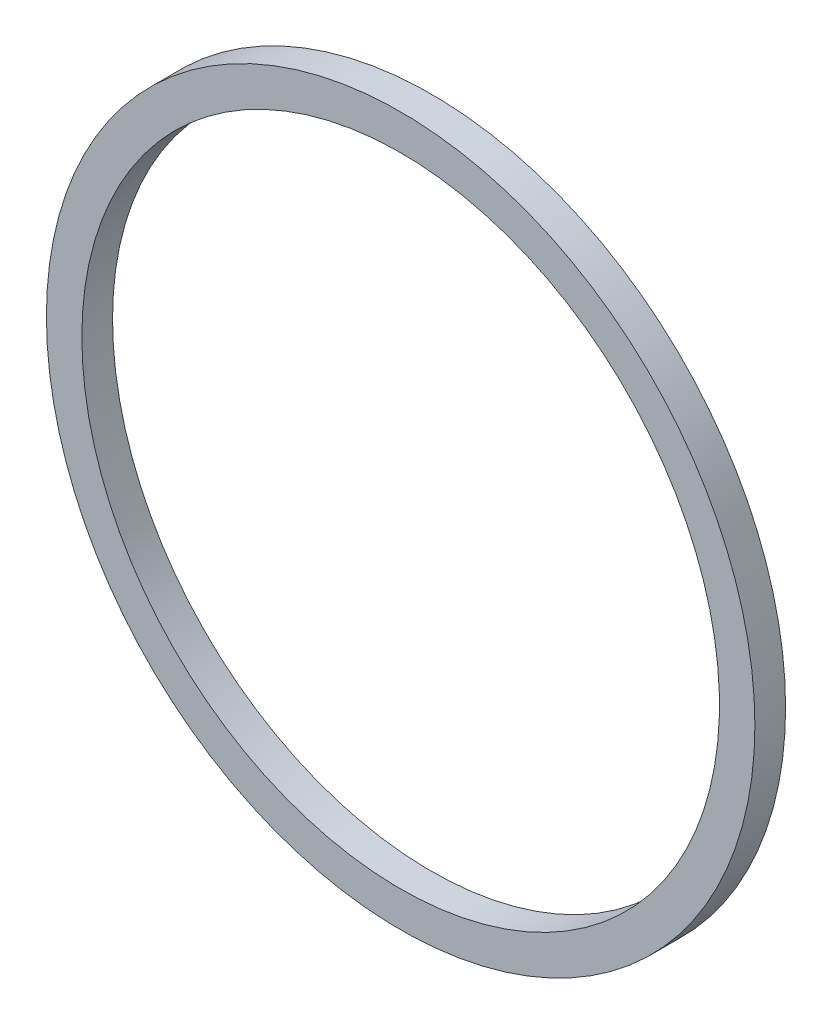
ISO-10303-21;
HEADER;
FILE_DESCRIPTION(('STEP AP214'),'2;1');
FILE_NAME('part.step','',(''),(''),'','','');
FILE_SCHEMA(('AUTOMOTIVE_DESIGN { 1 0 10303 214 1 1 1 1 }'));
ENDSEC;
DATA;
#1=APPLICATION_CONTEXT('core data for automotive mechanical design processes');
#2=APPLICATION_PROTOCOL_DEFINITION('international standard','automotive_design',2000,#1);
#3=PRODUCT_CONTEXT('',#1,'mechanical');
#4=PRODUCT('Part','Part','',(#3));
#5=PRODUCT_RELATED_PRODUCT_CATEGORY('part','',(#4));
#6=PRODUCT_DEFINITION_FORMATION('','',#4);
#7=PRODUCT_DEFINITION_CONTEXT('part definition',#1,'design');
#8=PRODUCT_DEFINITION('design','',#6,#7);
#9=PRODUCT_DEFINITION_SHAPE('','',#8);
#10=(LENGTH_UNIT() NAMED_UNIT(*) SI_UNIT(.MILLI.,.METRE.));
#11=(NAMED_UNIT(*) PLANE_ANGLE_UNIT() SI_UNIT($,.RADIAN.));
#12=(NAMED_UNIT(*) SI_UNIT($,.STERADIAN.) SOLID_ANGLE_UNIT());
#13=UNCERTAINTY_MEASURE_WITH_UNIT(LENGTH_MEASURE(1.E-05),#10,'distance_accuracy_value','');
#14=(GEOMETRIC_REPRESENTATION_CONTEXT(3) GLOBAL_UNCERTAINTY_ASSIGNED_CONTEXT((#13)) GLOBAL_UNIT_ASSIGNED_CONTEXT((#10,
#11,#12)) REPRESENTATION_CONTEXT('',''));
#15=CARTESIAN_POINT('',(0.,0.,0.));
#16=DIRECTION('',(0.,0.,1.));
#17=DIRECTION('',(1.,0.,0.));
#18=AXIS2_PLACEMENT_3D('',#15,#16,#17);
#19=CARTESIAN_POINT('',(0.,0.,13.));
#20=DIRECTION('',(0.,0.,1.));
#21=DIRECTION('',(1.,0.,0.));
#22=AXIS2_PLACEMENT_3D('',#19,#20,#21);
#23=PLANE('',#22);
#24=CARTESIAN_POINT('',(0.,0.,13.));
#25=DIRECTION('',(0.,0.,1.));
#26=DIRECTION('',(1.,0.,0.));
#27=AXIS2_PLACEMENT_3D('',#24,#25,#26);
#28=CIRCLE('',#27,150.);
#29=CARTESIAN_POINT('',(-150.,0.,13.));
#30=VERTEX_POINT('',#29);
#31=EDGE_CURVE('E10',#30,#30,#28,.T.);
#32=ORIENTED_EDGE('',*,*,#31,.T.);
#33=EDGE_LOOP('',(#32));
#34=FACE_BOUND('',#33,.T.);
#35=CARTESIAN_POINT('',(0.,0.,13.));
#36=DIRECTION('',(0.,0.,1.));
#37=DIRECTION('',(1.,0.,0.));
#38=AXIS2_PLACEMENT_3D('',#35,#36,#37);
#39=CIRCLE('',#38,135.);
#40=CARTESIAN_POINT('',(-135.,0.,13.));
#41=VERTEX_POINT('',#40);
#42=EDGE_CURVE('E46',#41,#41,#39,.T.);
#43=ORIENTED_EDGE('',*,*,#42,.F.);
#44=EDGE_LOOP('',(#43));
#45=FACE_BOUND('',#44,.T.);
#46=ADVANCED_FACE('F35',(#34,#45),#23,.T.);
#47=CARTESIAN_POINT('',(0.,0.,0.));
#48=DIRECTION('',(0.,0.,1.));
#49=DIRECTION('',(1.,0.,0.));
#50=AXIS2_PLACEMENT_3D('',#47,#48,#49);
#51=PLANE('',#50);
#52=CARTESIAN_POINT('',(0.,0.,0.));
#53=DIRECTION('',(0.,0.,1.));
#54=DIRECTION('',(1.,0.,0.));
#55=AXIS2_PLACEMENT_3D('',#52,#53,#54);
#56=CIRCLE('',#55,150.);
#57=CARTESIAN_POINT('',(-150.,0.,0.));
#58=VERTEX_POINT('',#57);
#59=EDGE_CURVE('E39',#58,#58,#56,.T.);
#60=ORIENTED_EDGE('',*,*,#59,.F.);
#61=EDGE_LOOP('',(#60));
#62=FACE_BOUND('',#61,.T.);
#63=CARTESIAN_POINT('',(0.,0.,0.));
#64=DIRECTION('',(0.,0.,1.));
#65=DIRECTION('',(1.,0.,0.));
#66=AXIS2_PLACEMENT_3D('',#63,#64,#65);
#67=CIRCLE('',#66,135.);
#68=CARTESIAN_POINT('',(-135.,0.,0.));
#69=VERTEX_POINT('',#68);
#70=EDGE_CURVE('E48',#69,#69,#67,.T.);
#71=ORIENTED_EDGE('',*,*,#70,.T.);
#72=EDGE_LOOP('',(#71));
#73=FACE_BOUND('',#72,.T.);
#74=ADVANCED_FACE('F58',(#62,#73),#51,.F.);
#75=CARTESIAN_POINT('',(0.,0.,13.));
#76=DIRECTION('',(0.,0.,-1.));
#77=DIRECTION('',(-1.,0.,0.));
#78=AXIS2_PLACEMENT_3D('',#75,#76,#77);
#79=CYLINDRICAL_SURFACE('',#78,150.);
#80=CARTESIAN_POINT('',(-150.,0.,13.));
#81=CARTESIAN_POINT('',(-150.,0.,12.8645833333333));
#82=CARTESIAN_POINT('',(-150.,0.,12.7291666666667));
#83=CARTESIAN_POINT('',(-150.,0.,12.4583333333333));
#84=CARTESIAN_POINT('',(-150.,0.,12.3229166666667));
#85=CARTESIAN_POINT('',(-150.,0.,12.0520833333333));
#86=CARTESIAN_POINT('',(-150.,0.,11.9166666666667));
#87=CARTESIAN_POINT('',(-150.,0.,11.6458333333333));
#88=CARTESIAN_POINT('',(-150.,0.,11.5104166666667));
#89=CARTESIAN_POINT('',(-150.,0.,11.2395833333333));
#90=CARTESIAN_POINT('',(-150.,0.,11.1041666666667));
#91=CARTESIAN_POINT('',(-150.,0.,10.8333333333333));
#92=CARTESIAN_POINT('',(-150.,0.,10.6979166666667));
#93=CARTESIAN_POINT('',(-150.,0.,10.4270833333333));
#94=CARTESIAN_POINT('',(-150.,0.,10.2916666666667));
#95=CARTESIAN_POINT('',(-150.,0.,10.0208333333333));
#96=CARTESIAN_POINT('',(-150.,0.,9.88541666666667));
#97=CARTESIAN_POINT('',(-150.,0.,9.61458333333333));
#98=CARTESIAN_POINT('',(-150.,0.,9.47916666666667));
#99=CARTESIAN_POINT('',(-150.,0.,9.20833333333333));
#100=CARTESIAN_POINT('',(-150.,0.,9.07291666666666));
#101=CARTESIAN_POINT('',(-150.,0.,8.80208333333333));
#102=CARTESIAN_POINT('',(-150.,0.,8.66666666666667));
#103=CARTESIAN_POINT('',(-150.,0.,8.39583333333333));
#104=CARTESIAN_POINT('',(-150.,0.,8.26041666666667));
#105=CARTESIAN_POINT('',(-150.,0.,7.98958333333333));
#106=CARTESIAN_POINT('',(-150.,0.,7.85416666666667));
#107=CARTESIAN_POINT('',(-150.,0.,7.58333333333333));
#108=CARTESIAN_POINT('',(-150.,0.,7.44791666666667));
#109=CARTESIAN_POINT('',(-150.,0.,7.17708333333333));
#110=CARTESIAN_POINT('',(-150.,0.,7.04166666666667));
#111=CARTESIAN_POINT('',(-150.,0.,6.77083333333333));
#112=CARTESIAN_POINT('',(-150.,0.,6.63541666666667));
#113=CARTESIAN_POINT('',(-150.,0.,6.36458333333333));
#114=CARTESIAN_POINT('',(-150.,0.,6.22916666666667));
#115=CARTESIAN_POINT('',(-150.,0.,5.95833333333333));
#116=CARTESIAN_POINT('',(-150.,0.,5.82291666666667));
#117=CARTESIAN_POINT('',(-150.,0.,5.55208333333333));
#118=CARTESIAN_POINT('',(-150.,0.,5.41666666666667));
#119=CARTESIAN_POINT('',(-150.,0.,5.14583333333333));
#120=CARTESIAN_POINT('',(-150.,0.,5.01041666666667));
#121=CARTESIAN_POINT('',(-150.,0.,4.73958333333333));
#122=CARTESIAN_POINT('',(-150.,0.,4.60416666666667));
#123=CARTESIAN_POINT('',(-150.,0.,4.33333333333333));
#124=CARTESIAN_POINT('',(-150.,0.,4.19791666666667));
#125=CARTESIAN_POINT('',(-150.,0.,3.92708333333333));
#126=CARTESIAN_POINT('',(-150.,0.,3.79166666666667));
#127=CARTESIAN_POINT('',(-150.,0.,3.52083333333333));
#128=CARTESIAN_POINT('',(-150.,0.,3.38541666666667));
#129=CARTESIAN_POINT('',(-150.,0.,3.11458333333333));
#130=CARTESIAN_POINT('',(-150.,0.,2.97916666666667));
#131=CARTESIAN_POINT('',(-150.,0.,2.70833333333333));
#132=CARTESIAN_POINT('',(-150.,0.,2.57291666666667));
#133=CARTESIAN_POINT('',(-150.,0.,2.30208333333333));
#134=CARTESIAN_POINT('',(-150.,0.,2.16666666666667));
#135=CARTESIAN_POINT('',(-150.,0.,1.89583333333333));
#136=CARTESIAN_POINT('',(-150.,0.,1.76041666666667));
#137=CARTESIAN_POINT('',(-150.,0.,1.48958333333333));
#138=CARTESIAN_POINT('',(-150.,0.,1.35416666666667));
#139=CARTESIAN_POINT('',(-150.,0.,1.08333333333333));
#140=CARTESIAN_POINT('',(-150.,0.,0.947916666666667));
#141=CARTESIAN_POINT('',(-150.,0.,0.677083333333334));
#142=CARTESIAN_POINT('',(-150.,0.,0.541666666666667));
#143=CARTESIAN_POINT('',(-150.,0.,0.270833333333334));
#144=CARTESIAN_POINT('',(-150.,0.,0.135416666666667));
#145=CARTESIAN_POINT('',(-150.,0.,0.));
#146=B_SPLINE_CURVE_WITH_KNOTS('',3,(#80,#81,#82,#83,#84,#85,#86,#87,#88,#89,#90,#91,#92,#93,
#94,#95,#96,#97,#98,#99,#100,#101,#102,#103,#104,#105,#106,#107,#108,#109,#110,#111,#112,#113,
#114,#115,#116,#117,#118,#119,#120,#121,#122,#123,#124,#125,#126,#127,#128,#129,#130,#131,#132,
#133,#134,#135,#136,#137,#138,#139,#140,#141,#142,#143,#144,#145),.UNSPECIFIED.,.F.,.F.,(4,2,2,
2,2,2,2,2,2,2,2,2,2,2,2,2,2,2,2,2,2,2,2,2,2,2,2,2,2,2,2,2,4),(0.,0.40625,0.812500000000001,
1.21875,1.625,2.03125,2.4375,2.84375,3.25,3.65625,4.0625,4.46875,4.875,5.28125,5.6875,6.09375,
6.5,6.90625,7.3125,7.71875,8.125,8.53125,8.9375,9.34375,9.75,10.15625,10.5625,10.96875,11.375,
11.78125,12.1875,12.59375,13.),.UNSPECIFIED.);
#147=EDGE_CURVE('BSEAM37',#30,#58,#146,.T.);
#148=ORIENTED_EDGE('',*,*,#31,.F.);
#149=ORIENTED_EDGE('',*,*,#59,.T.);
#150=ORIENTED_EDGE('',*,*,#147,.T.);
#151=ORIENTED_EDGE('',*,*,#147,.F.);
#152=EDGE_LOOP('',(#148,#150,#149,#151));
#153=FACE_BOUND('',#152,.T.);
#154=ADVANCED_FACE('F37',(#153),#79,.T.);
#155=CARTESIAN_POINT('',(0.,0.,13.));
#156=DIRECTION('',(0.,0.,-1.));
#157=DIRECTION('',(-1.,0.,0.));
#158=AXIS2_PLACEMENT_3D('',#155,#156,#157);
#159=CYLINDRICAL_SURFACE('',#158,135.);
#160=CARTESIAN_POINT('',(-135.,0.,13.));
#161=CARTESIAN_POINT('',(-135.,0.,12.8645833333333));
#162=CARTESIAN_POINT('',(-135.,0.,12.7291666666667));
#163=CARTESIAN_POINT('',(-135.,0.,12.4583333333333));
#164=CARTESIAN_POINT('',(-135.,0.,12.3229166666667));
#165=CARTESIAN_POINT('',(-135.,0.,12.0520833333333));
#166=CARTESIAN_POINT('',(-135.,0.,11.9166666666667));
#167=CARTESIAN_POINT('',(-135.,0.,11.6458333333333));
#168=CARTESIAN_POINT('',(-135.,0.,11.5104166666667));
#169=CARTESIAN_POINT('',(-135.,0.,11.2395833333333));
#170=CARTESIAN_POINT('',(-135.,0.,11.1041666666667));
#171=CARTESIAN_POINT('',(-135.,0.,10.8333333333333));
#172=CARTESIAN_POINT('',(-135.,0.,10.6979166666667));
#173=CARTESIAN_POINT('',(-135.,0.,10.4270833333333));
#174=CARTESIAN_POINT('',(-135.,0.,10.2916666666667));
#175=CARTESIAN_POINT('',(-135.,0.,10.0208333333333));
#176=CARTESIAN_POINT('',(-135.,0.,9.88541666666667));
#177=CARTESIAN_POINT('',(-135.,0.,9.61458333333333));
#178=CARTESIAN_POINT('',(-135.,0.,9.47916666666667));
#179=CARTESIAN_POINT('',(-135.,0.,9.20833333333333));
#180=CARTESIAN_POINT('',(-135.,0.,9.07291666666667));
#181=CARTESIAN_POINT('',(-135.,0.,8.80208333333333));
#182=CARTESIAN_POINT('',(-135.,0.,8.66666666666667));
#183=CARTESIAN_POINT('',(-135.,0.,8.39583333333333));
#184=CARTESIAN_POINT('',(-135.,0.,8.26041666666667));
#185=CARTESIAN_POINT('',(-135.,0.,7.98958333333333));
#186=CARTESIAN_POINT('',(-135.,0.,7.85416666666667));
#187=CARTESIAN_POINT('',(-135.,0.,7.58333333333333));
#188=CARTESIAN_POINT('',(-135.,0.,7.44791666666667));
#189=CARTESIAN_POINT('',(-135.,0.,7.17708333333333));
#190=CARTESIAN_POINT('',(-135.,0.,7.04166666666667));
#191=CARTESIAN_POINT('',(-135.,0.,6.77083333333333));
#192=CARTESIAN_POINT('',(-135.,0.,6.63541666666667));
#193=CARTESIAN_POINT('',(-135.,0.,6.36458333333333));
#194=CARTESIAN_POINT('',(-135.,0.,6.22916666666667));
#195=CARTESIAN_POINT('',(-135.,0.,5.95833333333333));
#196=CARTESIAN_POINT('',(-135.,0.,5.82291666666667));
#197=CARTESIAN_POINT('',(-135.,0.,5.55208333333333));
#198=CARTESIAN_POINT('',(-135.,0.,5.41666666666667));
#199=CARTESIAN_POINT('',(-135.,0.,5.14583333333333));
#200=CARTESIAN_POINT('',(-135.,0.,5.01041666666667));
#201=CARTESIAN_POINT('',(-135.,0.,4.73958333333333));
#202=CARTESIAN_POINT('',(-135.,0.,4.60416666666667));
#203=CARTESIAN_POINT('',(-135.,0.,4.33333333333333));
#204=CARTESIAN_POINT('',(-135.,0.,4.19791666666667));
#205=CARTESIAN_POINT('',(-135.,0.,3.92708333333333));
#206=CARTESIAN_POINT('',(-135.,0.,3.79166666666667));
#207=CARTESIAN_POINT('',(-135.,0.,3.52083333333333));
#208=CARTESIAN_POINT('',(-135.,0.,3.38541666666667));
#209=CARTESIAN_POINT('',(-135.,0.,3.11458333333333));
#210=CARTESIAN_POINT('',(-135.,0.,2.97916666666667));
#211=CARTESIAN_POINT('',(-135.,0.,2.70833333333333));
#212=CARTESIAN_POINT('',(-135.,0.,2.57291666666667));
#213=CARTESIAN_POINT('',(-135.,0.,2.30208333333333));
#214=CARTESIAN_POINT('',(-135.,0.,2.16666666666667));
#215=CARTESIAN_POINT('',(-135.,0.,1.89583333333333));
#216=CARTESIAN_POINT('',(-135.,0.,1.76041666666667));
#217=CARTESIAN_POINT('',(-135.,0.,1.48958333333333));
#218=CARTESIAN_POINT('',(-135.,0.,1.35416666666667));
#219=CARTESIAN_POINT('',(-135.,0.,1.08333333333333));
#220=CARTESIAN_POINT('',(-135.,0.,0.947916666666667));
#221=CARTESIAN_POINT('',(-135.,0.,0.677083333333334));
#222=CARTESIAN_POINT('',(-135.,0.,0.541666666666667));
#223=CARTESIAN_POINT('',(-135.,0.,0.270833333333334));
#224=CARTESIAN_POINT('',(-135.,0.,0.135416666666667));
#225=CARTESIAN_POINT('',(-135.,0.,0.));
#226=B_SPLINE_CURVE_WITH_KNOTS('',3,(#160,#161,#162,#163,#164,#165,#166,#167,#168,#169,#170,
#171,#172,#173,#174,#175,#176,#177,#178,#179,#180,#181,#182,#183,#184,#185,#186,#187,#188,#189,
#190,#191,#192,#193,#194,#195,#196,#197,#198,#199,#200,#201,#202,#203,#204,#205,#206,#207,#208,
#209,#210,#211,#212,#213,#214,#215,#216,#217,#218,#219,#220,#221,#222,#223,#224,#225),
.UNSPECIFIED.,.F.,.F.,(4,2,2,2,2,2,2,2,2,2,2,2,2,2,2,2,2,2,2,2,2,2,2,2,2,2,2,2,2,2,2,2,4),(0.,
0.406249999999999,0.812499999999999,1.21875,1.625,2.03125,2.4375,2.84375,3.25,3.65625,4.0625,
4.46875,4.875,5.28125,5.6875,6.09375,6.5,6.90625,7.3125,7.71875,8.125,8.53125,8.9375,9.34375,
9.75,10.15625,10.5625,10.96875,11.375,11.78125,12.1875,12.59375,13.),.UNSPECIFIED.);
#227=EDGE_CURVE('BSEAM54',#41,#69,#226,.T.);
#228=ORIENTED_EDGE('',*,*,#42,.T.);
#229=ORIENTED_EDGE('',*,*,#70,.F.);
#230=ORIENTED_EDGE('',*,*,#227,.T.);
#231=ORIENTED_EDGE('',*,*,#227,.F.);
#232=EDGE_LOOP('',(#228,#230,#229,#231));
#233=FACE_BOUND('',#232,.T.);
#234=ADVANCED_FACE('F54',(#233),#159,.F.);
#235=CLOSED_SHELL('',(#46,#74,#154,#234));
#236=MANIFOLD_SOLID_BREP('B2',#235);
#237=ADVANCED_BREP_SHAPE_REPRESENTATION('',(#18,#236),#14);
#238=SHAPE_DEFINITION_REPRESENTATION(#9,#237);
ENDSEC;
END-ISO-10303-21;
